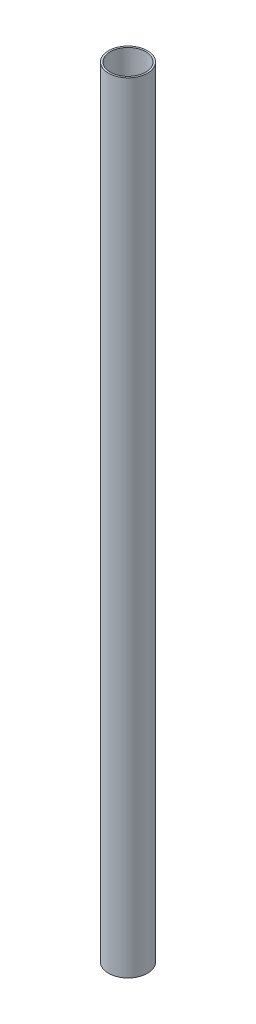
ISO-10303-21;
HEADER;
FILE_DESCRIPTION(('STEP AP214'),'2;1');
FILE_NAME('part.step','',(''),(''),'','','');
FILE_SCHEMA(('AUTOMOTIVE_DESIGN { 1 0 10303 214 1 1 1 1 }'));
ENDSEC;
DATA;
#1=APPLICATION_CONTEXT('core data for automotive mechanical design processes');
#2=APPLICATION_PROTOCOL_DEFINITION('international standard','automotive_design',2000,#1);
#3=PRODUCT_CONTEXT('',#1,'mechanical');
#4=PRODUCT('Part','Part','',(#3));
#5=PRODUCT_RELATED_PRODUCT_CATEGORY('part','',(#4));
#6=PRODUCT_DEFINITION_FORMATION('','',#4);
#7=PRODUCT_DEFINITION_CONTEXT('part definition',#1,'design');
#8=PRODUCT_DEFINITION('design','',#6,#7);
#9=PRODUCT_DEFINITION_SHAPE('','',#8);
#10=(LENGTH_UNIT() NAMED_UNIT(*) SI_UNIT(.MILLI.,.METRE.));
#11=(NAMED_UNIT(*) PLANE_ANGLE_UNIT() SI_UNIT($,.RADIAN.));
#12=(NAMED_UNIT(*) SI_UNIT($,.STERADIAN.) SOLID_ANGLE_UNIT());
#13=UNCERTAINTY_MEASURE_WITH_UNIT(LENGTH_MEASURE(1.E-05),#10,'distance_accuracy_value','');
#14=(GEOMETRIC_REPRESENTATION_CONTEXT(3) GLOBAL_UNCERTAINTY_ASSIGNED_CONTEXT((#13)) GLOBAL_UNIT_ASSIGNED_CONTEXT((#10,
#11,#12)) REPRESENTATION_CONTEXT('',''));
#15=CARTESIAN_POINT('',(0.,0.,0.));
#16=DIRECTION('',(0.,0.,1.));
#17=DIRECTION('',(1.,0.,0.));
#18=AXIS2_PLACEMENT_3D('',#15,#16,#17);
#19=CARTESIAN_POINT('',(0.,220.,0.));
#20=DIRECTION('',(0.,1.,0.));
#21=DIRECTION('',(0.,0.,1.));
#22=AXIS2_PLACEMENT_3D('',#19,#20,#21);
#23=PLANE('',#22);
#24=CARTESIAN_POINT('',(0.,220.,0.));
#25=DIRECTION('',(0.,1.,0.));
#26=DIRECTION('',(0.,0.,1.));
#27=AXIS2_PLACEMENT_3D('',#24,#25,#26);
#28=CIRCLE('',#27,11.);
#29=CARTESIAN_POINT('',(0.,220.,11.));
#30=VERTEX_POINT('',#29);
#31=EDGE_CURVE('E10',#30,#30,#28,.T.);
#32=ORIENTED_EDGE('',*,*,#31,.T.);
#33=EDGE_LOOP('',(#32));
#34=FACE_BOUND('',#33,.T.);
#35=CARTESIAN_POINT('',(0.,220.,0.));
#36=DIRECTION('',(0.,1.,0.));
#37=DIRECTION('',(0.,0.,1.));
#38=AXIS2_PLACEMENT_3D('',#35,#36,#37);
#39=CIRCLE('',#38,10.);
#40=CARTESIAN_POINT('',(0.,220.,10.));
#41=VERTEX_POINT('',#40);
#42=EDGE_CURVE('E41',#41,#41,#39,.T.);
#43=ORIENTED_EDGE('',*,*,#42,.F.);
#44=EDGE_LOOP('',(#43));
#45=FACE_BOUND('',#44,.T.);
#46=ADVANCED_FACE('F30',(#34,#45),#23,.T.);
#47=CARTESIAN_POINT('',(0.,-220.,0.));
#48=DIRECTION('',(0.,1.,0.));
#49=DIRECTION('',(0.,0.,1.));
#50=AXIS2_PLACEMENT_3D('',#47,#48,#49);
#51=PLANE('',#50);
#52=CARTESIAN_POINT('',(0.,-220.,0.));
#53=DIRECTION('',(0.,1.,0.));
#54=DIRECTION('',(0.,0.,1.));
#55=AXIS2_PLACEMENT_3D('',#52,#53,#54);
#56=CIRCLE('',#55,11.);
#57=CARTESIAN_POINT('',(0.,-220.,11.));
#58=VERTEX_POINT('',#57);
#59=EDGE_CURVE('E34',#58,#58,#56,.T.);
#60=ORIENTED_EDGE('',*,*,#59,.F.);
#61=EDGE_LOOP('',(#60));
#62=FACE_BOUND('',#61,.T.);
#63=CARTESIAN_POINT('',(0.,-220.,0.));
#64=DIRECTION('',(0.,1.,0.));
#65=DIRECTION('',(0.,0.,1.));
#66=AXIS2_PLACEMENT_3D('',#63,#64,#65);
#67=CIRCLE('',#66,10.);
#68=CARTESIAN_POINT('',(0.,-220.,10.));
#69=VERTEX_POINT('',#68);
#70=EDGE_CURVE('E43',#69,#69,#67,.T.);
#71=ORIENTED_EDGE('',*,*,#70,.T.);
#72=EDGE_LOOP('',(#71));
#73=FACE_BOUND('',#72,.T.);
#74=ADVANCED_FACE('F53',(#62,#73),#51,.F.);
#75=CARTESIAN_POINT('',(0.,220.,0.));
#76=DIRECTION('',(0.,-1.,0.));
#77=DIRECTION('',(0.,0.,-1.));
#78=AXIS2_PLACEMENT_3D('',#75,#76,#77);
#79=CYLINDRICAL_SURFACE('',#78,11.);
#80=ORIENTED_EDGE('',*,*,#31,.F.);
#81=EDGE_LOOP('',(#80));
#82=FACE_BOUND('',#81,.T.);
#83=ORIENTED_EDGE('',*,*,#59,.T.);
#84=EDGE_LOOP('',(#83));
#85=FACE_BOUND('',#84,.T.);
#86=ADVANCED_FACE('F32',(#82,#85),#79,.T.);
#87=CARTESIAN_POINT('',(0.,220.,0.));
#88=DIRECTION('',(0.,-1.,0.));
#89=DIRECTION('',(0.,0.,-1.));
#90=AXIS2_PLACEMENT_3D('',#87,#88,#89);
#91=CYLINDRICAL_SURFACE('',#90,10.);
#92=ORIENTED_EDGE('',*,*,#42,.T.);
#93=EDGE_LOOP('',(#92));
#94=FACE_BOUND('',#93,.T.);
#95=ORIENTED_EDGE('',*,*,#70,.F.);
#96=EDGE_LOOP('',(#95));
#97=FACE_BOUND('',#96,.T.);
#98=ADVANCED_FACE('F49',(#94,#97),#91,.F.);
#99=CLOSED_SHELL('',(#46,#74,#86,#98));
#100=MANIFOLD_SOLID_BREP('B2',#99);
#101=ADVANCED_BREP_SHAPE_REPRESENTATION('',(#18,#100),#14);
#102=SHAPE_DEFINITION_REPRESENTATION(#9,#101);
ENDSEC;
END-ISO-10303-21;
